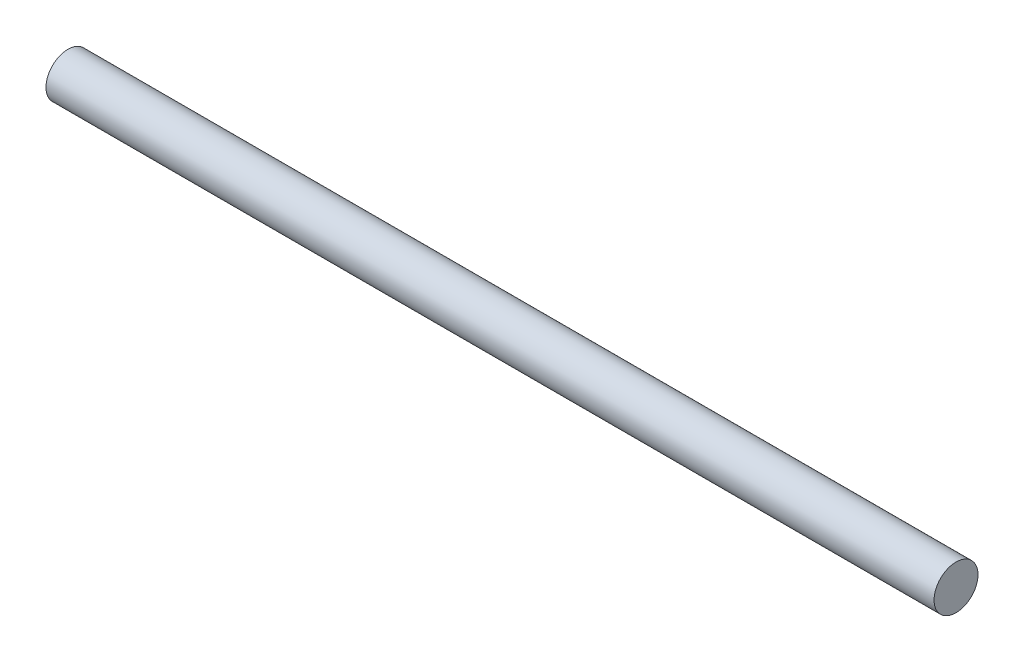
ISO-10303-21;
HEADER;
FILE_DESCRIPTION(('STEP AP214'),'2;1');
FILE_NAME('part.step','',(''),(''),'','','');
FILE_SCHEMA(('AUTOMOTIVE_DESIGN { 1 0 10303 214 1 1 1 1 }'));
ENDSEC;
DATA;
#1=APPLICATION_CONTEXT('core data for automotive mechanical design processes');
#2=APPLICATION_PROTOCOL_DEFINITION('international standard','automotive_design',2000,#1);
#3=PRODUCT_CONTEXT('',#1,'mechanical');
#4=PRODUCT('Part','Part','',(#3));
#5=PRODUCT_RELATED_PRODUCT_CATEGORY('part','',(#4));
#6=PRODUCT_DEFINITION_FORMATION('','',#4);
#7=PRODUCT_DEFINITION_CONTEXT('part definition',#1,'design');
#8=PRODUCT_DEFINITION('design','',#6,#7);
#9=PRODUCT_DEFINITION_SHAPE('','',#8);
#10=(LENGTH_UNIT() NAMED_UNIT(*) SI_UNIT(.MILLI.,.METRE.));
#11=(NAMED_UNIT(*) PLANE_ANGLE_UNIT() SI_UNIT($,.RADIAN.));
#12=(NAMED_UNIT(*) SI_UNIT($,.STERADIAN.) SOLID_ANGLE_UNIT());
#13=UNCERTAINTY_MEASURE_WITH_UNIT(LENGTH_MEASURE(1.E-05),#10,'distance_accuracy_value','');
#14=(GEOMETRIC_REPRESENTATION_CONTEXT(3) GLOBAL_UNCERTAINTY_ASSIGNED_CONTEXT((#13)) GLOBAL_UNIT_ASSIGNED_CONTEXT((#10,
#11,#12)) REPRESENTATION_CONTEXT('',''));
#15=CARTESIAN_POINT('',(0.,0.,0.));
#16=DIRECTION('',(0.,0.,1.));
#17=DIRECTION('',(1.,0.,0.));
#18=AXIS2_PLACEMENT_3D('',#15,#16,#17);
#19=CARTESIAN_POINT('',(101.,0.,0.));
#20=DIRECTION('',(-1.,0.,0.));
#21=DIRECTION('',(0.,0.,1.));
#22=AXIS2_PLACEMENT_3D('',#19,#20,#21);
#23=CYLINDRICAL_SURFACE('',#22,2.5);
#24=CARTESIAN_POINT('',(101.,0.,0.));
#25=DIRECTION('',(1.,0.,0.));
#26=DIRECTION('',(0.,0.,-1.));
#27=AXIS2_PLACEMENT_3D('',#24,#25,#26);
#28=CIRCLE('',#27,2.5);
#29=CARTESIAN_POINT('',(101.,0.,-2.5));
#30=VERTEX_POINT('',#29);
#31=EDGE_CURVE('E10',#30,#30,#28,.T.);
#32=ORIENTED_EDGE('',*,*,#31,.F.);
#33=EDGE_LOOP('',(#32));
#34=FACE_BOUND('',#33,.T.);
#35=CARTESIAN_POINT('',(0.,0.,0.));
#36=DIRECTION('',(1.,0.,0.));
#37=DIRECTION('',(0.,0.,-1.));
#38=AXIS2_PLACEMENT_3D('',#35,#36,#37);
#39=CIRCLE('',#38,2.5);
#40=CARTESIAN_POINT('',(0.,0.,-2.5));
#41=VERTEX_POINT('',#40);
#42=EDGE_CURVE('E34',#41,#41,#39,.T.);
#43=ORIENTED_EDGE('',*,*,#42,.T.);
#44=EDGE_LOOP('',(#43));
#45=FACE_BOUND('',#44,.T.);
#46=ADVANCED_FACE('F31',(#34,#45),#23,.T.);
#47=CARTESIAN_POINT('',(101.,0.,0.));
#48=DIRECTION('',(1.,0.,0.));
#49=DIRECTION('',(0.,0.,-1.));
#50=AXIS2_PLACEMENT_3D('',#47,#48,#49);
#51=PLANE('',#50);
#52=ORIENTED_EDGE('',*,*,#31,.T.);
#53=EDGE_LOOP('',(#52));
#54=FACE_BOUND('',#53,.T.);
#55=ADVANCED_FACE('F46',(#54),#51,.T.);
#56=CARTESIAN_POINT('',(0.,0.,0.));
#57=DIRECTION('',(1.,0.,0.));
#58=DIRECTION('',(0.,0.,-1.));
#59=AXIS2_PLACEMENT_3D('',#56,#57,#58);
#60=PLANE('',#59);
#61=ORIENTED_EDGE('',*,*,#42,.F.);
#62=EDGE_LOOP('',(#61));
#63=FACE_BOUND('',#62,.T.);
#64=ADVANCED_FACE('F44',(#63),#60,.F.);
#65=CLOSED_SHELL('',(#46,#55,#64));
#66=MANIFOLD_SOLID_BREP('B2',#65);
#67=ADVANCED_BREP_SHAPE_REPRESENTATION('',(#18,#66),#14);
#68=SHAPE_DEFINITION_REPRESENTATION(#9,#67);
ENDSEC;
END-ISO-10303-21;
